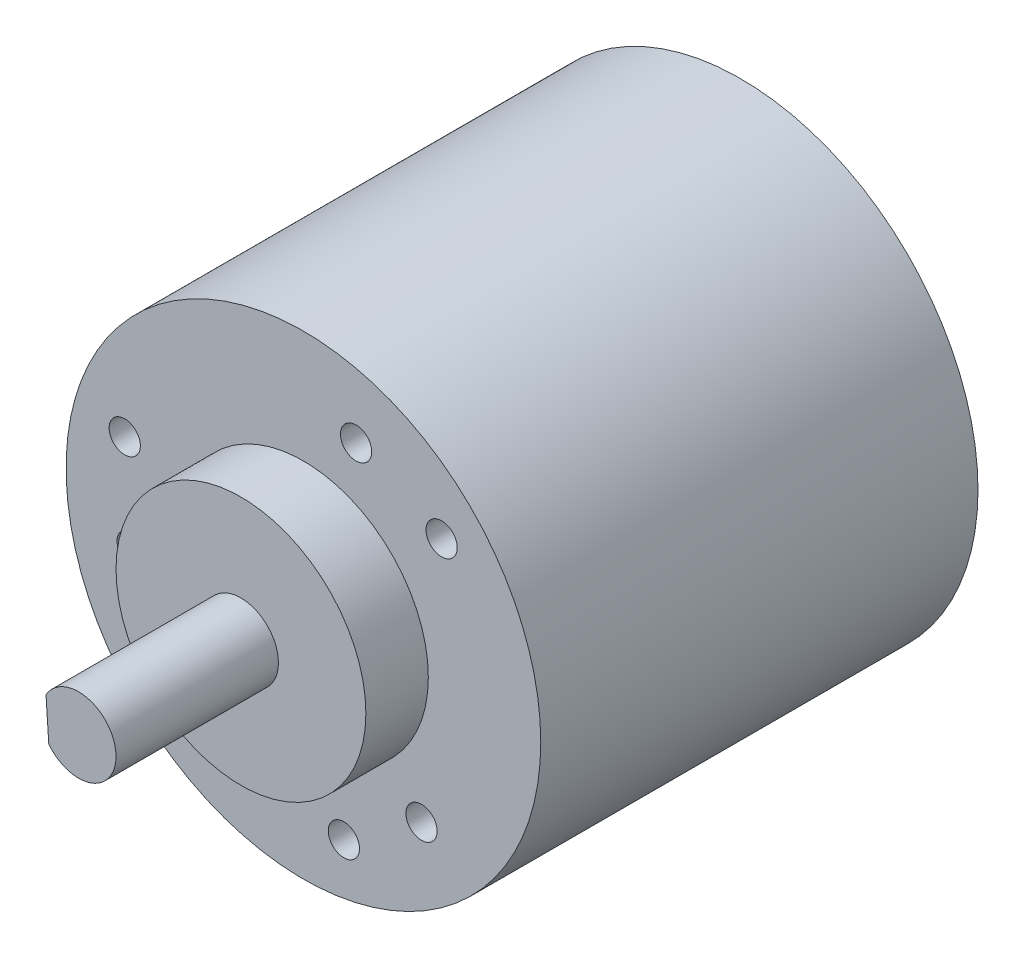
ISO-10303-21;
HEADER;
FILE_DESCRIPTION(('STEP AP214'),'2;1');
FILE_NAME('part.step','',(''),(''),'','','');
FILE_SCHEMA(('AUTOMOTIVE_DESIGN { 1 0 10303 214 1 1 1 1 }'));
ENDSEC;
DATA;
#1=APPLICATION_CONTEXT('core data for automotive mechanical design processes');
#2=APPLICATION_PROTOCOL_DEFINITION('international standard','automotive_design',2000,#1);
#3=PRODUCT_CONTEXT('',#1,'mechanical');
#4=PRODUCT('Part','Part','',(#3));
#5=PRODUCT_RELATED_PRODUCT_CATEGORY('part','',(#4));
#6=PRODUCT_DEFINITION_FORMATION('','',#4);
#7=PRODUCT_DEFINITION_CONTEXT('part definition',#1,'design');
#8=PRODUCT_DEFINITION('design','',#6,#7);
#9=PRODUCT_DEFINITION_SHAPE('','',#8);
#10=(LENGTH_UNIT() NAMED_UNIT(*) SI_UNIT(.MILLI.,.METRE.));
#11=(NAMED_UNIT(*) PLANE_ANGLE_UNIT() SI_UNIT($,.RADIAN.));
#12=(NAMED_UNIT(*) SI_UNIT($,.STERADIAN.) SOLID_ANGLE_UNIT());
#13=UNCERTAINTY_MEASURE_WITH_UNIT(LENGTH_MEASURE(1.E-05),#10,'distance_accuracy_value','');
#14=(GEOMETRIC_REPRESENTATION_CONTEXT(3) GLOBAL_UNCERTAINTY_ASSIGNED_CONTEXT((#13)) GLOBAL_UNIT_ASSIGNED_CONTEXT((#10,
#11,#12)) REPRESENTATION_CONTEXT('',''));
#15=CARTESIAN_POINT('',(0.,0.,0.));
#16=DIRECTION('',(0.,0.,1.));
#17=DIRECTION('',(1.,0.,0.));
#18=AXIS2_PLACEMENT_3D('',#15,#16,#17);
#19=CARTESIAN_POINT('',(0.,0.,35.));
#20=DIRECTION('',(0.,0.,-1.));
#21=DIRECTION('',(-1.,0.,0.));
#22=AXIS2_PLACEMENT_3D('',#19,#20,#21);
#23=CYLINDRICAL_SURFACE('',#22,19.);
#24=CARTESIAN_POINT('',(0.,0.,35.));
#25=DIRECTION('',(0.,0.,1.));
#26=DIRECTION('',(1.,0.,0.));
#27=AXIS2_PLACEMENT_3D('',#24,#25,#26);
#28=CIRCLE('',#27,19.);
#29=CARTESIAN_POINT('',(19.,0.,35.));
#30=VERTEX_POINT('',#29);
#31=EDGE_CURVE('E11',#30,#30,#28,.T.);
#32=ORIENTED_EDGE('',*,*,#31,.F.);
#33=EDGE_LOOP('',(#32));
#34=FACE_BOUND('',#33,.T.);
#35=CARTESIAN_POINT('',(0.,0.,0.));
#36=DIRECTION('',(0.,0.,1.));
#37=DIRECTION('',(1.,0.,0.));
#38=AXIS2_PLACEMENT_3D('',#35,#36,#37);
#39=CIRCLE('',#38,19.);
#40=CARTESIAN_POINT('',(19.,0.,0.));
#41=VERTEX_POINT('',#40);
#42=EDGE_CURVE('E36',#41,#41,#39,.T.);
#43=ORIENTED_EDGE('',*,*,#42,.T.);
#44=EDGE_LOOP('',(#43));
#45=FACE_BOUND('',#44,.T.);
#46=ADVANCED_FACE('F33',(#34,#45),#23,.T.);
#47=CARTESIAN_POINT('',(0.,0.,35.));
#48=DIRECTION('',(0.,0.,1.));
#49=DIRECTION('',(1.,0.,0.));
#50=AXIS2_PLACEMENT_3D('',#47,#48,#49);
#51=PLANE('',#50);
#52=CARTESIAN_POINT('',(4.21630395639813,13.3500105223652,35.));
#53=DIRECTION('',(0.,0.,1.));
#54=DIRECTION('',(1.,0.,0.));
#55=AXIS2_PLACEMENT_3D('',#52,#53,#54);
#56=CIRCLE('',#55,1.25);
#57=CARTESIAN_POINT('',(5.46630395639812,13.3500105223652,35.));
#58=VERTEX_POINT('',#57);
#59=EDGE_CURVE('E70',#58,#58,#56,.T.);
#60=ORIENTED_EDGE('',*,*,#59,.F.);
#61=EDGE_LOOP('',(#60));
#62=FACE_BOUND('',#61,.T.);
#63=CARTESIAN_POINT('',(11.0640338544645,10.1285317231701,35.));
#64=DIRECTION('',(0.,0.,1.));
#65=DIRECTION('',(1.,0.,0.));
#66=AXIS2_PLACEMENT_3D('',#63,#64,#65);
#67=CIRCLE('',#66,1.25);
#68=CARTESIAN_POINT('',(12.3140338544645,10.1285317231701,35.));
#69=VERTEX_POINT('',#68);
#70=EDGE_CURVE('E297',#69,#69,#67,.T.);
#71=ORIENTED_EDGE('',*,*,#70,.F.);
#72=EDGE_LOOP('',(#71));
#73=FACE_BOUND('',#72,.T.);
#74=CARTESIAN_POINT('',(9.45329627495879,-10.3264315975002,35.));
#75=DIRECTION('',(0.,0.,1.));
#76=DIRECTION('',(1.,0.,0.));
#77=AXIS2_PLACEMENT_3D('',#74,#75,#76);
#78=CIRCLE('',#77,1.25);
#79=CARTESIAN_POINT('',(10.7032962749588,-10.3264315975002,35.));
#80=VERTEX_POINT('',#79);
#81=EDGE_CURVE('E291',#80,#80,#78,.T.);
#82=ORIENTED_EDGE('',*,*,#81,.F.);
#83=EDGE_LOOP('',(#82));
#84=FACE_BOUND('',#83,.T.);
#85=CARTESIAN_POINT('',(3.23954884806965,-14.6460002478824,35.));
#86=DIRECTION('',(0.,0.,1.));
#87=DIRECTION('',(1.,0.,0.));
#88=AXIS2_PLACEMENT_3D('',#85,#86,#87);
#89=CIRCLE('',#88,1.25);
#90=CARTESIAN_POINT('',(4.48954884806965,-14.6460002478824,35.));
#91=VERTEX_POINT('',#90);
#92=EDGE_CURVE('E290',#91,#91,#89,.T.);
#93=ORIENTED_EDGE('',*,*,#92,.F.);
#94=EDGE_LOOP('',(#93));
#95=FACE_BOUND('',#94,.T.);
#96=CARTESIAN_POINT('',(-13.6696002313569,-3.02357892486496,35.));
#97=DIRECTION('',(0.,0.,1.));
#98=DIRECTION('',(1.,0.,0.));
#99=AXIS2_PLACEMENT_3D('',#96,#97,#98);
#100=CIRCLE('',#99,1.25);
#101=CARTESIAN_POINT('',(-12.4196002313569,-3.02357892486496,35.));
#102=VERTEX_POINT('',#101);
#103=EDGE_CURVE('E308',#102,#102,#100,.T.);
#104=ORIENTED_EDGE('',*,*,#103,.F.);
#105=EDGE_LOOP('',(#104));
#106=FACE_BOUND('',#105,.T.);
#107=CARTESIAN_POINT('',(-14.3035827025342,4.51746852471222,35.));
#108=DIRECTION('',(0.,0.,1.));
#109=DIRECTION('',(1.,0.,0.));
#110=AXIS2_PLACEMENT_3D('',#107,#108,#109);
#111=CIRCLE('',#110,1.25);
#112=CARTESIAN_POINT('',(-13.0535827025342,4.51746852471222,35.));
#113=VERTEX_POINT('',#112);
#114=EDGE_CURVE('E81',#113,#113,#111,.T.);
#115=ORIENTED_EDGE('',*,*,#114,.F.);
#116=EDGE_LOOP('',(#115));
#117=FACE_BOUND('',#116,.T.);
#118=CARTESIAN_POINT('',(0.,0.,35.));
#119=DIRECTION('',(0.,0.,1.));
#120=DIRECTION('',(1.,0.,0.));
#121=AXIS2_PLACEMENT_3D('',#118,#119,#120);
#122=CIRCLE('',#121,10.);
#123=CARTESIAN_POINT('',(10.,0.,35.));
#124=VERTEX_POINT('',#123);
#125=EDGE_CURVE('E73',#124,#124,#122,.T.);
#126=ORIENTED_EDGE('',*,*,#125,.F.);
#127=EDGE_LOOP('',(#126));
#128=FACE_BOUND('',#127,.T.);
#129=ORIENTED_EDGE('',*,*,#31,.T.);
#130=EDGE_LOOP('',(#129));
#131=FACE_BOUND('',#130,.T.);
#132=ADVANCED_FACE('F94',(#62,#73,#84,#95,#106,#117,#128,#131),#51,.T.);
#133=CARTESIAN_POINT('',(0.,0.,0.));
#134=DIRECTION('',(0.,0.,1.));
#135=DIRECTION('',(1.,0.,0.));
#136=AXIS2_PLACEMENT_3D('',#133,#134,#135);
#137=PLANE('',#136);
#138=ORIENTED_EDGE('',*,*,#42,.F.);
#139=EDGE_LOOP('',(#138));
#140=FACE_BOUND('',#139,.T.);
#141=ADVANCED_FACE('F91',(#140),#137,.F.);
#142=CARTESIAN_POINT('',(0.,0.,40.));
#143=DIRECTION('',(0.,0.,-1.));
#144=DIRECTION('',(-1.,0.,0.));
#145=AXIS2_PLACEMENT_3D('',#142,#143,#144);
#146=CYLINDRICAL_SURFACE('',#145,10.);
#147=CARTESIAN_POINT('',(0.,0.,40.));
#148=DIRECTION('',(0.,0.,1.));
#149=DIRECTION('',(1.,0.,0.));
#150=AXIS2_PLACEMENT_3D('',#147,#148,#149);
#151=CIRCLE('',#150,10.);
#152=CARTESIAN_POINT('',(10.,0.,40.));
#153=VERTEX_POINT('',#152);
#154=EDGE_CURVE('E76',#153,#153,#151,.T.);
#155=ORIENTED_EDGE('',*,*,#154,.F.);
#156=EDGE_LOOP('',(#155));
#157=FACE_BOUND('',#156,.T.);
#158=ORIENTED_EDGE('',*,*,#125,.T.);
#159=EDGE_LOOP('',(#158));
#160=FACE_BOUND('',#159,.T.);
#161=ADVANCED_FACE('F93',(#157,#160),#146,.T.);
#162=CARTESIAN_POINT('',(0.,0.,40.));
#163=DIRECTION('',(0.,0.,1.));
#164=DIRECTION('',(1.,0.,0.));
#165=AXIS2_PLACEMENT_3D('',#162,#163,#164);
#166=PLANE('',#165);
#167=CARTESIAN_POINT('',(0.,0.,40.));
#168=DIRECTION('',(0.,0.,1.));
#169=DIRECTION('',(1.,0.,0.));
#170=AXIS2_PLACEMENT_3D('',#167,#168,#169);
#171=CIRCLE('',#170,3.);
#172=CARTESIAN_POINT('',(-2.38241901927405,-1.82320586237574,40.));
#173=VERTEX_POINT('',#172);
#174=CARTESIAN_POINT('',(-2.60618788557232,1.48586160361458,40.));
#175=VERTEX_POINT('',#174);
#176=EDGE_CURVE('E69',#173,#175,#171,.T.);
#177=ORIENTED_EDGE('',*,*,#176,.F.);
#178=DIRECTION('',(-0.067468851752233,0.997721380969274,0.));
#179=VECTOR('',#178,1.);
#180=CARTESIAN_POINT('',(-2.38241901927405,-1.82320586237574,40.));
#181=LINE('',#180,#179);
#182=EDGE_CURVE('E62',#173,#175,#181,.T.);
#183=ORIENTED_EDGE('',*,*,#182,.T.);
#184=EDGE_LOOP('',(#177,#183));
#185=FACE_BOUND('',#184,.T.);
#186=ORIENTED_EDGE('',*,*,#154,.T.);
#187=EDGE_LOOP('',(#186));
#188=FACE_BOUND('',#187,.T.);
#189=ADVANCED_FACE('F99',(#185,#188),#166,.T.);
#190=CARTESIAN_POINT('',(0.,0.,53.));
#191=DIRECTION('',(0.,0.,-1.));
#192=DIRECTION('',(-1.,0.,0.));
#193=AXIS2_PLACEMENT_3D('',#190,#191,#192);
#194=CYLINDRICAL_SURFACE('',#193,3.);
#195=CARTESIAN_POINT('',(0.,0.,53.));
#196=DIRECTION('',(0.,0.,1.));
#197=DIRECTION('',(1.,0.,0.));
#198=AXIS2_PLACEMENT_3D('',#195,#196,#197);
#199=CIRCLE('',#198,3.);
#200=CARTESIAN_POINT('',(-2.38241901927405,-1.82320586237574,53.));
#201=VERTEX_POINT('',#200);
#202=CARTESIAN_POINT('',(-2.60618788557232,1.48586160361458,53.));
#203=VERTEX_POINT('',#202);
#204=EDGE_CURVE('E67',#201,#203,#199,.T.);
#205=ORIENTED_EDGE('',*,*,#204,.F.);
#206=DIRECTION('',(0.,0.,1.));
#207=VECTOR('',#206,1.);
#208=CARTESIAN_POINT('',(-2.38241901927405,-1.82320586237574,40.));
#209=LINE('',#208,#207);
#210=EDGE_CURVE('E47',#173,#201,#209,.T.);
#211=ORIENTED_EDGE('',*,*,#210,.F.);
#212=ORIENTED_EDGE('',*,*,#176,.T.);
#213=DIRECTION('',(0.,0.,1.));
#214=VECTOR('',#213,1.);
#215=CARTESIAN_POINT('',(-2.60618788557232,1.48586160361458,40.));
#216=LINE('',#215,#214);
#217=EDGE_CURVE('E53',#175,#203,#216,.T.);
#218=ORIENTED_EDGE('',*,*,#217,.T.);
#219=EDGE_LOOP('',(#205,#211,#212,#218));
#220=FACE_BOUND('',#219,.T.);
#221=ADVANCED_FACE('F66',(#220),#194,.T.);
#222=CARTESIAN_POINT('',(0.,0.,53.));
#223=DIRECTION('',(0.,0.,1.));
#224=DIRECTION('',(1.,0.,0.));
#225=AXIS2_PLACEMENT_3D('',#222,#223,#224);
#226=PLANE('',#225);
#227=DIRECTION('',(-0.067468851752233,0.997721380969274,0.));
#228=VECTOR('',#227,1.);
#229=CARTESIAN_POINT('',(-2.38241901927405,-1.82320586237574,53.));
#230=LINE('',#229,#228);
#231=EDGE_CURVE('E57',#201,#203,#230,.T.);
#232=ORIENTED_EDGE('',*,*,#231,.F.);
#233=ORIENTED_EDGE('',*,*,#204,.T.);
#234=EDGE_LOOP('',(#232,#233));
#235=FACE_BOUND('',#234,.T.);
#236=ADVANCED_FACE('F72',(#235),#226,.T.);
#237=CARTESIAN_POINT('',(-14.3035827025342,4.51746852471222,27.));
#238=DIRECTION('',(0.,0.,1.));
#239=DIRECTION('',(1.,0.,0.));
#240=AXIS2_PLACEMENT_3D('',#237,#238,#239);
#241=CYLINDRICAL_SURFACE('',#240,1.25);
#242=CARTESIAN_POINT('',(-14.3035827025342,4.51746852471222,27.));
#243=DIRECTION('',(0.,0.,1.));
#244=DIRECTION('',(1.,0.,0.));
#245=AXIS2_PLACEMENT_3D('',#242,#243,#244);
#246=CIRCLE('',#245,1.25);
#247=CARTESIAN_POINT('',(-13.0535827025342,4.51746852471222,27.));
#248=VERTEX_POINT('',#247);
#249=EDGE_CURVE('E78',#248,#248,#246,.T.);
#250=ORIENTED_EDGE('',*,*,#249,.F.);
#251=EDGE_LOOP('',(#250));
#252=FACE_BOUND('',#251,.T.);
#253=ORIENTED_EDGE('',*,*,#114,.T.);
#254=EDGE_LOOP('',(#253));
#255=FACE_BOUND('',#254,.T.);
#256=ADVANCED_FACE('F123',(#252,#255),#241,.F.);
#257=CARTESIAN_POINT('',(0.,0.,27.));
#258=DIRECTION('',(0.,0.,1.));
#259=DIRECTION('',(1.,0.,0.));
#260=AXIS2_PLACEMENT_3D('',#257,#258,#259);
#261=PLANE('',#260);
#262=ORIENTED_EDGE('',*,*,#249,.T.);
#263=EDGE_LOOP('',(#262));
#264=FACE_BOUND('',#263,.T.);
#265=ADVANCED_FACE('F128',(#264),#261,.T.);
#266=CARTESIAN_POINT('',(-13.6696002313569,-3.02357892486496,27.));
#267=DIRECTION('',(0.,0.,1.));
#268=DIRECTION('',(1.,0.,0.));
#269=AXIS2_PLACEMENT_3D('',#266,#267,#268);
#270=CYLINDRICAL_SURFACE('',#269,1.25);
#271=CARTESIAN_POINT('',(-13.6696002313569,-3.02357892486496,27.));
#272=DIRECTION('',(0.,0.,1.));
#273=DIRECTION('',(1.,0.,0.));
#274=AXIS2_PLACEMENT_3D('',#271,#272,#273);
#275=CIRCLE('',#274,1.25);
#276=CARTESIAN_POINT('',(-12.4196002313569,-3.02357892486496,27.));
#277=VERTEX_POINT('',#276);
#278=EDGE_CURVE('E305',#277,#277,#275,.T.);
#279=ORIENTED_EDGE('',*,*,#278,.F.);
#280=EDGE_LOOP('',(#279));
#281=FACE_BOUND('',#280,.T.);
#282=ORIENTED_EDGE('',*,*,#103,.T.);
#283=EDGE_LOOP('',(#282));
#284=FACE_BOUND('',#283,.T.);
#285=ADVANCED_FACE('F140',(#281,#284),#270,.F.);
#286=CARTESIAN_POINT('',(0.,0.,27.));
#287=DIRECTION('',(0.,0.,1.));
#288=DIRECTION('',(1.,0.,0.));
#289=AXIS2_PLACEMENT_3D('',#286,#287,#288);
#290=PLANE('',#289);
#291=ORIENTED_EDGE('',*,*,#278,.T.);
#292=EDGE_LOOP('',(#291));
#293=FACE_BOUND('',#292,.T.);
#294=ADVANCED_FACE('F150',(#293),#290,.T.);
#295=CARTESIAN_POINT('',(3.23954884806965,-14.6460002478824,27.));
#296=DIRECTION('',(0.,0.,1.));
#297=DIRECTION('',(1.,0.,0.));
#298=AXIS2_PLACEMENT_3D('',#295,#296,#297);
#299=CYLINDRICAL_SURFACE('',#298,1.25);
#300=CARTESIAN_POINT('',(3.23954884806965,-14.6460002478824,27.));
#301=DIRECTION('',(0.,0.,1.));
#302=DIRECTION('',(1.,0.,0.));
#303=AXIS2_PLACEMENT_3D('',#300,#301,#302);
#304=CIRCLE('',#303,1.25);
#305=CARTESIAN_POINT('',(4.48954884806965,-14.6460002478824,27.));
#306=VERTEX_POINT('',#305);
#307=EDGE_CURVE('E311',#306,#306,#304,.T.);
#308=ORIENTED_EDGE('',*,*,#307,.F.);
#309=EDGE_LOOP('',(#308));
#310=FACE_BOUND('',#309,.T.);
#311=ORIENTED_EDGE('',*,*,#92,.T.);
#312=EDGE_LOOP('',(#311));
#313=FACE_BOUND('',#312,.T.);
#314=ADVANCED_FACE('F160',(#310,#313),#299,.F.);
#315=CARTESIAN_POINT('',(0.,0.,27.));
#316=DIRECTION('',(0.,0.,1.));
#317=DIRECTION('',(1.,0.,0.));
#318=AXIS2_PLACEMENT_3D('',#315,#316,#317);
#319=PLANE('',#318);
#320=ORIENTED_EDGE('',*,*,#307,.T.);
#321=EDGE_LOOP('',(#320));
#322=FACE_BOUND('',#321,.T.);
#323=ADVANCED_FACE('F170',(#322),#319,.T.);
#324=CARTESIAN_POINT('',(9.45329627495879,-10.3264315975002,27.));
#325=DIRECTION('',(0.,0.,1.));
#326=DIRECTION('',(1.,0.,0.));
#327=AXIS2_PLACEMENT_3D('',#324,#325,#326);
#328=CYLINDRICAL_SURFACE('',#327,1.25);
#329=CARTESIAN_POINT('',(9.45329627495879,-10.3264315975002,27.));
#330=DIRECTION('',(0.,0.,1.));
#331=DIRECTION('',(1.,0.,0.));
#332=AXIS2_PLACEMENT_3D('',#329,#330,#331);
#333=CIRCLE('',#332,1.25);
#334=CARTESIAN_POINT('',(10.7032962749588,-10.3264315975002,27.));
#335=VERTEX_POINT('',#334);
#336=EDGE_CURVE('E287',#335,#335,#333,.T.);
#337=ORIENTED_EDGE('',*,*,#336,.F.);
#338=EDGE_LOOP('',(#337));
#339=FACE_BOUND('',#338,.T.);
#340=ORIENTED_EDGE('',*,*,#81,.T.);
#341=EDGE_LOOP('',(#340));
#342=FACE_BOUND('',#341,.T.);
#343=ADVANCED_FACE('F180',(#339,#342),#328,.F.);
#344=CARTESIAN_POINT('',(0.,0.,27.));
#345=DIRECTION('',(0.,0.,1.));
#346=DIRECTION('',(1.,0.,0.));
#347=AXIS2_PLACEMENT_3D('',#344,#345,#346);
#348=PLANE('',#347);
#349=ORIENTED_EDGE('',*,*,#336,.T.);
#350=EDGE_LOOP('',(#349));
#351=FACE_BOUND('',#350,.T.);
#352=ADVANCED_FACE('F190',(#351),#348,.T.);
#353=CARTESIAN_POINT('',(11.0640338544645,10.1285317231701,27.));
#354=DIRECTION('',(0.,0.,1.));
#355=DIRECTION('',(1.,0.,0.));
#356=AXIS2_PLACEMENT_3D('',#353,#354,#355);
#357=CYLINDRICAL_SURFACE('',#356,1.25);
#358=CARTESIAN_POINT('',(11.0640338544645,10.1285317231701,27.));
#359=DIRECTION('',(0.,0.,1.));
#360=DIRECTION('',(1.,0.,0.));
#361=AXIS2_PLACEMENT_3D('',#358,#359,#360);
#362=CIRCLE('',#361,1.25);
#363=CARTESIAN_POINT('',(12.3140338544645,10.1285317231701,27.));
#364=VERTEX_POINT('',#363);
#365=EDGE_CURVE('E294',#364,#364,#362,.T.);
#366=ORIENTED_EDGE('',*,*,#365,.F.);
#367=EDGE_LOOP('',(#366));
#368=FACE_BOUND('',#367,.T.);
#369=ORIENTED_EDGE('',*,*,#70,.T.);
#370=EDGE_LOOP('',(#369));
#371=FACE_BOUND('',#370,.T.);
#372=ADVANCED_FACE('F200',(#368,#371),#357,.F.);
#373=CARTESIAN_POINT('',(0.,0.,27.));
#374=DIRECTION('',(0.,0.,1.));
#375=DIRECTION('',(1.,0.,0.));
#376=AXIS2_PLACEMENT_3D('',#373,#374,#375);
#377=PLANE('',#376);
#378=ORIENTED_EDGE('',*,*,#365,.T.);
#379=EDGE_LOOP('',(#378));
#380=FACE_BOUND('',#379,.T.);
#381=ADVANCED_FACE('F210',(#380),#377,.T.);
#382=CARTESIAN_POINT('',(4.21630395639813,13.3500105223652,27.));
#383=DIRECTION('',(0.,0.,1.));
#384=DIRECTION('',(1.,0.,0.));
#385=AXIS2_PLACEMENT_3D('',#382,#383,#384);
#386=CYLINDRICAL_SURFACE('',#385,1.25);
#387=CARTESIAN_POINT('',(4.21630395639813,13.3500105223652,27.));
#388=DIRECTION('',(0.,0.,1.));
#389=DIRECTION('',(1.,0.,0.));
#390=AXIS2_PLACEMENT_3D('',#387,#388,#389);
#391=CIRCLE('',#390,1.25);
#392=CARTESIAN_POINT('',(5.46630395639812,13.3500105223652,27.));
#393=VERTEX_POINT('',#392);
#394=EDGE_CURVE('E300',#393,#393,#391,.T.);
#395=ORIENTED_EDGE('',*,*,#394,.F.);
#396=EDGE_LOOP('',(#395));
#397=FACE_BOUND('',#396,.T.);
#398=ORIENTED_EDGE('',*,*,#59,.T.);
#399=EDGE_LOOP('',(#398));
#400=FACE_BOUND('',#399,.T.);
#401=ADVANCED_FACE('F220',(#397,#400),#386,.F.);
#402=CARTESIAN_POINT('',(0.,0.,27.));
#403=DIRECTION('',(0.,0.,1.));
#404=DIRECTION('',(1.,0.,0.));
#405=AXIS2_PLACEMENT_3D('',#402,#403,#404);
#406=PLANE('',#405);
#407=ORIENTED_EDGE('',*,*,#394,.T.);
#408=EDGE_LOOP('',(#407));
#409=FACE_BOUND('',#408,.T.);
#410=ADVANCED_FACE('F230',(#409),#406,.T.);
#411=CARTESIAN_POINT('',(-2.38241901927405,-1.82320586237574,40.));
#412=DIRECTION('',(0.997721380969274,0.067468851752233,0.));
#413=DIRECTION('',(-0.067468851752233,0.997721380969274,0.));
#414=AXIS2_PLACEMENT_3D('',#411,#412,#413);
#415=PLANE('',#414);
#416=ORIENTED_EDGE('',*,*,#231,.T.);
#417=ORIENTED_EDGE('',*,*,#217,.F.);
#418=ORIENTED_EDGE('',*,*,#182,.F.);
#419=ORIENTED_EDGE('',*,*,#210,.T.);
#420=EDGE_LOOP('',(#416,#417,#418,#419));
#421=FACE_BOUND('',#420,.T.);
#422=ADVANCED_FACE('F58',(#421),#415,.F.);
#423=CLOSED_SHELL('',(#46,#132,#141,#161,#189,#221,#236,#256,#265,#285,#294,#314,#323,#343,#352,
#372,#381,#401,#410,#422));
#424=MANIFOLD_SOLID_BREP('B2',#423);
#425=ADVANCED_BREP_SHAPE_REPRESENTATION('',(#18,#424),#14);
#426=SHAPE_DEFINITION_REPRESENTATION(#9,#425);
ENDSEC;
END-ISO-10303-21;
